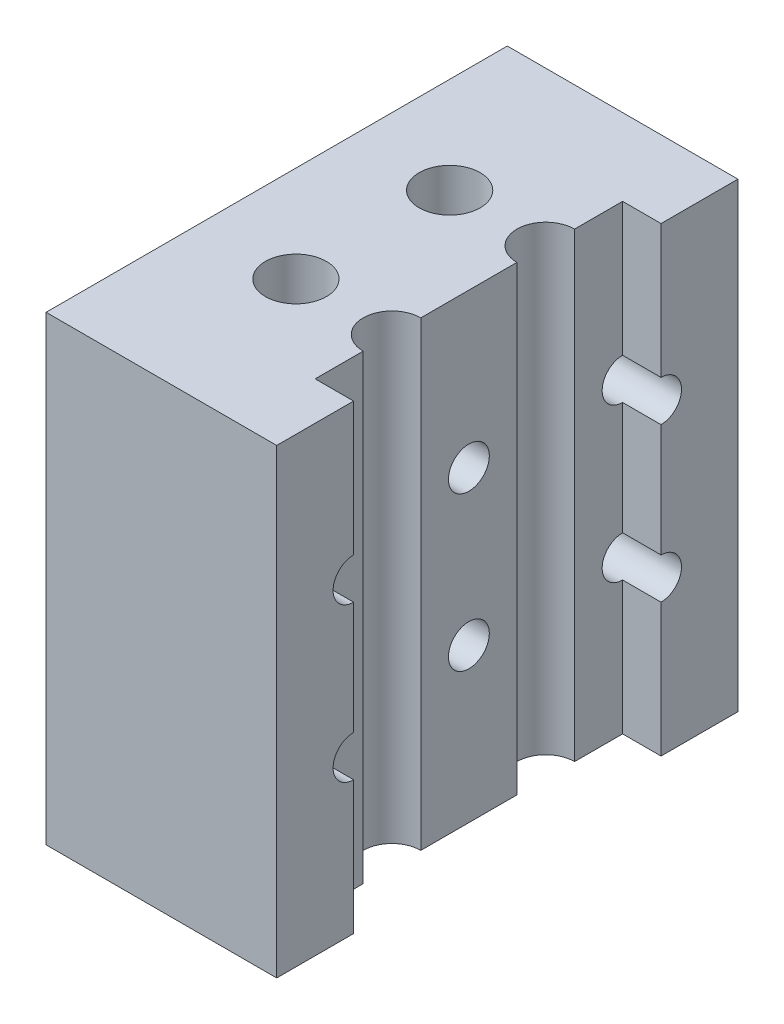
ISO-10303-21;
HEADER;
FILE_DESCRIPTION(('STEP AP214'),'2;1');
FILE_NAME('part.step','',(''),(''),'','','');
FILE_SCHEMA(('AUTOMOTIVE_DESIGN { 1 0 10303 214 1 1 1 1 }'));
ENDSEC;
DATA;
#1=APPLICATION_CONTEXT('core data for automotive mechanical design processes');
#2=APPLICATION_PROTOCOL_DEFINITION('international standard','automotive_design',2000,#1);
#3=PRODUCT_CONTEXT('',#1,'mechanical');
#4=PRODUCT('Part','Part','',(#3));
#5=PRODUCT_RELATED_PRODUCT_CATEGORY('part','',(#4));
#6=PRODUCT_DEFINITION_FORMATION('','',#4);
#7=PRODUCT_DEFINITION_CONTEXT('part definition',#1,'design');
#8=PRODUCT_DEFINITION('design','',#6,#7);
#9=PRODUCT_DEFINITION_SHAPE('','',#8);
#10=(LENGTH_UNIT() NAMED_UNIT(*) SI_UNIT(.MILLI.,.METRE.));
#11=(NAMED_UNIT(*) PLANE_ANGLE_UNIT() SI_UNIT($,.RADIAN.));
#12=(NAMED_UNIT(*) SI_UNIT($,.STERADIAN.) SOLID_ANGLE_UNIT());
#13=UNCERTAINTY_MEASURE_WITH_UNIT(LENGTH_MEASURE(1.E-05),#10,'distance_accuracy_value','');
#14=(GEOMETRIC_REPRESENTATION_CONTEXT(3) GLOBAL_UNCERTAINTY_ASSIGNED_CONTEXT((#13)) GLOBAL_UNIT_ASSIGNED_CONTEXT((#10,
#11,#12)) REPRESENTATION_CONTEXT('',''));
#15=CARTESIAN_POINT('',(0.,0.,0.));
#16=DIRECTION('',(0.,0.,1.));
#17=DIRECTION('',(1.,0.,0.));
#18=AXIS2_PLACEMENT_3D('',#15,#16,#17);
#19=CARTESIAN_POINT('',(-6.34999999999999,0.,-25.4));
#20=DIRECTION('',(-1.,0.,0.));
#21=DIRECTION('',(0.,0.,1.));
#22=AXIS2_PLACEMENT_3D('',#19,#20,#21);
#23=PLANE('',#22);
#24=DIRECTION('',(0.,0.,1.));
#25=VECTOR('',#24,1.);
#26=CARTESIAN_POINT('',(-6.34999999999999,0.,-25.4));
#27=LINE('',#26,#25);
#28=CARTESIAN_POINT('',(-6.34999999999998,0.,17.4625));
#29=VERTEX_POINT('',#28);
#30=CARTESIAN_POINT('',(-6.34999999999998,0.,25.4));
#31=VERTEX_POINT('',#30);
#32=EDGE_CURVE('E188',#29,#31,#27,.T.);
#33=ORIENTED_EDGE('',*,*,#32,.F.);
#34=DIRECTION('',(0.,1.,0.));
#35=VECTOR('',#34,1.);
#36=CARTESIAN_POINT('',(-6.34999999999998,0.,17.4625));
#37=LINE('',#36,#35);
#38=CARTESIAN_POINT('',(-6.34999999999998,76.2,17.4625));
#39=VERTEX_POINT('',#38);
#40=EDGE_CURVE('E50',#29,#39,#37,.T.);
#41=ORIENTED_EDGE('',*,*,#40,.T.);
#42=DIRECTION('',(0.,0.,1.));
#43=VECTOR('',#42,1.);
#44=CARTESIAN_POINT('',(-6.34999999999999,76.2,-25.4));
#45=LINE('',#44,#43);
#46=CARTESIAN_POINT('',(-6.34999999999998,76.2,25.4));
#47=VERTEX_POINT('',#46);
#48=EDGE_CURVE('E201',#39,#47,#45,.T.);
#49=ORIENTED_EDGE('',*,*,#48,.T.);
#50=DIRECTION('',(0.,1.,0.));
#51=VECTOR('',#50,1.);
#52=CARTESIAN_POINT('',(-6.34999999999998,0.,25.4));
#53=LINE('',#52,#51);
#54=CARTESIAN_POINT('',(-6.34999999999998,54.1782,25.4));
#55=VERTEX_POINT('',#54);
#56=EDGE_CURVE('E219',#55,#47,#53,.T.);
#57=ORIENTED_EDGE('',*,*,#56,.F.);
#58=CARTESIAN_POINT('',(-6.34999999999998,50.8,25.4));
#59=DIRECTION('',(-1.,0.,0.));
#60=DIRECTION('',(0.,0.,1.));
#61=AXIS2_PLACEMENT_3D('',#58,#59,#60);
#62=CIRCLE('',#61,3.37819999999999);
#63=CARTESIAN_POINT('',(-6.34999999999998,47.4218,25.4));
#64=VERTEX_POINT('',#63);
#65=EDGE_CURVE('E271',#55,#64,#62,.T.);
#66=ORIENTED_EDGE('',*,*,#65,.T.);
#67=CARTESIAN_POINT('',(-6.34999999999998,28.7782,25.4));
#68=VERTEX_POINT('',#67);
#69=EDGE_CURVE('E218',#68,#64,#53,.T.);
#70=ORIENTED_EDGE('',*,*,#69,.F.);
#71=CARTESIAN_POINT('',(-6.34999999999998,25.4,25.4));
#72=DIRECTION('',(-1.,0.,0.));
#73=DIRECTION('',(0.,0.,1.));
#74=AXIS2_PLACEMENT_3D('',#71,#72,#73);
#75=CIRCLE('',#74,3.37819999999999);
#76=CARTESIAN_POINT('',(-6.34999999999998,22.0218,25.4));
#77=VERTEX_POINT('',#76);
#78=EDGE_CURVE('E274',#68,#77,#75,.T.);
#79=ORIENTED_EDGE('',*,*,#78,.T.);
#80=EDGE_CURVE('E215',#31,#77,#53,.T.);
#81=ORIENTED_EDGE('',*,*,#80,.F.);
#82=EDGE_LOOP('',(#33,#41,#49,#57,#66,#70,#79,#81));
#83=FACE_BOUND('',#82,.T.);
#84=ADVANCED_FACE('F35',(#83),#23,.F.);
#85=CARTESIAN_POINT('',(-6.34999999999999,25.4,0.));
#86=DIRECTION('',(-1.,0.,0.));
#87=DIRECTION('',(0.,0.,1.));
#88=AXIS2_PLACEMENT_3D('',#85,#86,#87);
#89=CIRCLE('',#88,3.37819999999999);
#90=CARTESIAN_POINT('',(-6.34999999999999,25.4,3.37819999999999));
#91=VERTEX_POINT('',#90);
#92=EDGE_CURVE('E278',#91,#91,#89,.T.);
#93=ORIENTED_EDGE('',*,*,#92,.T.);
#94=EDGE_LOOP('',(#93));
#95=FACE_BOUND('',#94,.T.);
#96=CARTESIAN_POINT('',(-6.34999999999999,50.8,0.));
#97=DIRECTION('',(-1.,0.,0.));
#98=DIRECTION('',(0.,0.,1.));
#99=AXIS2_PLACEMENT_3D('',#96,#97,#98);
#100=CIRCLE('',#99,3.37819999999999);
#101=CARTESIAN_POINT('',(-6.34999999999999,50.8,3.37819999999999));
#102=VERTEX_POINT('',#101);
#103=EDGE_CURVE('E283',#102,#102,#100,.T.);
#104=ORIENTED_EDGE('',*,*,#103,.T.);
#105=EDGE_LOOP('',(#104));
#106=FACE_BOUND('',#105,.T.);
#107=CARTESIAN_POINT('',(-6.34999999999999,76.2,-7.9375));
#108=VERTEX_POINT('',#107);
#109=CARTESIAN_POINT('',(-6.34999999999999,76.2,7.9375));
#110=VERTEX_POINT('',#109);
#111=EDGE_CURVE('E182',#108,#110,#45,.T.);
#112=ORIENTED_EDGE('',*,*,#111,.T.);
#113=DIRECTION('',(0.,1.,0.));
#114=VECTOR('',#113,1.);
#115=CARTESIAN_POINT('',(-6.34999999999999,0.,7.9375));
#116=LINE('',#115,#114);
#117=CARTESIAN_POINT('',(-6.34999999999999,0.,7.9375));
#118=VERTEX_POINT('',#117);
#119=EDGE_CURVE('E170',#110,#118,#116,.F.);
#120=ORIENTED_EDGE('',*,*,#119,.T.);
#121=CARTESIAN_POINT('',(-6.34999999999999,0.,-7.9375));
#122=VERTEX_POINT('',#121);
#123=EDGE_CURVE('E180',#122,#118,#27,.T.);
#124=ORIENTED_EDGE('',*,*,#123,.F.);
#125=DIRECTION('',(0.,1.,0.));
#126=VECTOR('',#125,1.);
#127=CARTESIAN_POINT('',(-6.34999999999999,0.,-7.9375));
#128=LINE('',#127,#126);
#129=EDGE_CURVE('E43',#122,#108,#128,.T.);
#130=ORIENTED_EDGE('',*,*,#129,.T.);
#131=EDGE_LOOP('',(#112,#120,#124,#130));
#132=FACE_BOUND('',#131,.T.);
#133=ADVANCED_FACE('F178',(#95,#106,#132),#23,.F.);
#134=CARTESIAN_POINT('',(0.,0.,25.4));
#135=DIRECTION('',(0.,0.,1.));
#136=DIRECTION('',(1.,0.,0.));
#137=AXIS2_PLACEMENT_3D('',#134,#135,#136);
#138=PLANE('',#137);
#139=ORIENTED_EDGE('',*,*,#80,.T.);
#140=DIRECTION('',(1.,0.,0.));
#141=VECTOR('',#140,1.);
#142=CARTESIAN_POINT('',(0.,22.0218,25.4));
#143=LINE('',#142,#141);
#144=CARTESIAN_POINT('',(0.,22.0218,25.4));
#145=VERTEX_POINT('',#144);
#146=EDGE_CURVE('E321',#77,#145,#143,.T.);
#147=ORIENTED_EDGE('',*,*,#146,.T.);
#148=DIRECTION('',(0.,1.,0.));
#149=VECTOR('',#148,1.);
#150=CARTESIAN_POINT('',(0.,0.,25.4));
#151=LINE('',#150,#149);
#152=CARTESIAN_POINT('',(0.,0.,25.4));
#153=VERTEX_POINT('',#152);
#154=EDGE_CURVE('E209',#153,#145,#151,.T.);
#155=ORIENTED_EDGE('',*,*,#154,.F.);
#156=DIRECTION('',(1.,0.,0.));
#157=VECTOR('',#156,1.);
#158=CARTESIAN_POINT('',(0.,0.,25.4));
#159=LINE('',#158,#157);
#160=EDGE_CURVE('E190',#31,#153,#159,.T.);
#161=ORIENTED_EDGE('',*,*,#160,.F.);
#162=EDGE_LOOP('',(#139,#147,#155,#161));
#163=FACE_BOUND('',#162,.T.);
#164=ADVANCED_FACE('F381',(#163),#138,.F.);
#165=CARTESIAN_POINT('',(0.,28.7782,25.4));
#166=VERTEX_POINT('',#165);
#167=CARTESIAN_POINT('',(0.,47.4218,25.4));
#168=VERTEX_POINT('',#167);
#169=EDGE_CURVE('E213',#166,#168,#151,.T.);
#170=ORIENTED_EDGE('',*,*,#169,.F.);
#171=DIRECTION('',(1.,0.,0.));
#172=VECTOR('',#171,1.);
#173=CARTESIAN_POINT('',(0.,28.7782,25.4));
#174=LINE('',#173,#172);
#175=EDGE_CURVE('E384',#166,#68,#174,.F.);
#176=ORIENTED_EDGE('',*,*,#175,.T.);
#177=ORIENTED_EDGE('',*,*,#69,.T.);
#178=DIRECTION('',(1.,0.,0.));
#179=VECTOR('',#178,1.);
#180=CARTESIAN_POINT('',(0.,47.4218,25.4));
#181=LINE('',#180,#179);
#182=EDGE_CURVE('E319',#64,#168,#181,.T.);
#183=ORIENTED_EDGE('',*,*,#182,.T.);
#184=EDGE_LOOP('',(#170,#176,#177,#183));
#185=FACE_BOUND('',#184,.T.);
#186=ADVANCED_FACE('F323',(#185),#138,.F.);
#187=CARTESIAN_POINT('',(0.,0.,-25.4));
#188=DIRECTION('',(0.,0.,-1.));
#189=DIRECTION('',(-1.,0.,0.));
#190=AXIS2_PLACEMENT_3D('',#187,#188,#189);
#191=PLANE('',#190);
#192=DIRECTION('',(0.,1.,0.));
#193=VECTOR('',#192,1.);
#194=CARTESIAN_POINT('',(-6.34999999999999,0.,-25.4));
#195=LINE('',#194,#193);
#196=CARTESIAN_POINT('',(-6.34999999999999,54.1782,-25.4));
#197=VERTEX_POINT('',#196);
#198=CARTESIAN_POINT('',(-6.34999999999999,76.2,-25.4));
#199=VERTEX_POINT('',#198);
#200=EDGE_CURVE('E224',#197,#199,#195,.T.);
#201=ORIENTED_EDGE('',*,*,#200,.F.);
#202=DIRECTION('',(1.,0.,0.));
#203=VECTOR('',#202,1.);
#204=CARTESIAN_POINT('',(0.,54.1782,-25.4));
#205=LINE('',#204,#203);
#206=CARTESIAN_POINT('',(0.,54.1782,-25.4));
#207=VERTEX_POINT('',#206);
#208=EDGE_CURVE('E337',#197,#207,#205,.T.);
#209=ORIENTED_EDGE('',*,*,#208,.T.);
#210=DIRECTION('',(0.,1.,0.));
#211=VECTOR('',#210,1.);
#212=CARTESIAN_POINT('',(0.,0.,-25.4));
#213=LINE('',#212,#211);
#214=CARTESIAN_POINT('',(0.,76.2,-25.4));
#215=VERTEX_POINT('',#214);
#216=EDGE_CURVE('E197',#207,#215,#213,.T.);
#217=ORIENTED_EDGE('',*,*,#216,.T.);
#218=DIRECTION('',(-1.,0.,0.));
#219=VECTOR('',#218,1.);
#220=CARTESIAN_POINT('',(0.,76.2,-25.4));
#221=LINE('',#220,#219);
#222=EDGE_CURVE('E198',#215,#199,#221,.T.);
#223=ORIENTED_EDGE('',*,*,#222,.T.);
#224=EDGE_LOOP('',(#201,#209,#217,#223));
#225=FACE_BOUND('',#224,.T.);
#226=ADVANCED_FACE('F358',(#225),#191,.F.);
#227=CARTESIAN_POINT('',(0.,28.7782,-25.4));
#228=VERTEX_POINT('',#227);
#229=CARTESIAN_POINT('',(0.,47.4218,-25.4));
#230=VERTEX_POINT('',#229);
#231=EDGE_CURVE('E228',#228,#230,#213,.T.);
#232=ORIENTED_EDGE('',*,*,#231,.T.);
#233=DIRECTION('',(1.,0.,0.));
#234=VECTOR('',#233,1.);
#235=CARTESIAN_POINT('',(0.,47.4218,-25.4));
#236=LINE('',#235,#234);
#237=CARTESIAN_POINT('',(-6.34999999999999,47.4218,-25.4));
#238=VERTEX_POINT('',#237);
#239=EDGE_CURVE('E334',#230,#238,#236,.F.);
#240=ORIENTED_EDGE('',*,*,#239,.T.);
#241=CARTESIAN_POINT('',(-6.34999999999999,28.7782,-25.4));
#242=VERTEX_POINT('',#241);
#243=EDGE_CURVE('E223',#242,#238,#195,.T.);
#244=ORIENTED_EDGE('',*,*,#243,.F.);
#245=DIRECTION('',(1.,0.,0.));
#246=VECTOR('',#245,1.);
#247=CARTESIAN_POINT('',(0.,28.7782,-25.4));
#248=LINE('',#247,#246);
#249=EDGE_CURVE('E265',#242,#228,#248,.T.);
#250=ORIENTED_EDGE('',*,*,#249,.T.);
#251=EDGE_LOOP('',(#232,#240,#244,#250));
#252=FACE_BOUND('',#251,.T.);
#253=ADVANCED_FACE('F353',(#252),#191,.F.);
#254=CARTESIAN_POINT('',(0.,76.2,-38.1));
#255=DIRECTION('',(-1.,0.,0.));
#256=DIRECTION('',(0.,0.,1.));
#257=AXIS2_PLACEMENT_3D('',#254,#255,#256);
#258=PLANE('',#257);
#259=ORIENTED_EDGE('',*,*,#154,.T.);
#260=CARTESIAN_POINT('',(0.,25.4,25.4));
#261=DIRECTION('',(1.,0.,0.));
#262=DIRECTION('',(0.,0.,-1.));
#263=AXIS2_PLACEMENT_3D('',#260,#261,#262);
#264=CIRCLE('',#263,3.37819999999999);
#265=EDGE_CURVE('E281',#166,#145,#264,.T.);
#266=ORIENTED_EDGE('',*,*,#265,.F.);
#267=ORIENTED_EDGE('',*,*,#169,.T.);
#268=CARTESIAN_POINT('',(0.,50.8,25.4));
#269=DIRECTION('',(1.,0.,0.));
#270=DIRECTION('',(0.,0.,-1.));
#271=AXIS2_PLACEMENT_3D('',#268,#269,#270);
#272=CIRCLE('',#271,3.37819999999999);
#273=CARTESIAN_POINT('',(0.,54.1782,25.4));
#274=VERTEX_POINT('',#273);
#275=EDGE_CURVE('E310',#274,#168,#272,.T.);
#276=ORIENTED_EDGE('',*,*,#275,.F.);
#277=CARTESIAN_POINT('',(0.,76.2,25.4));
#278=VERTEX_POINT('',#277);
#279=EDGE_CURVE('E214',#274,#278,#151,.T.);
#280=ORIENTED_EDGE('',*,*,#279,.T.);
#281=DIRECTION('',(0.,0.,-1.));
#282=VECTOR('',#281,1.);
#283=CARTESIAN_POINT('',(0.,76.2,-38.1));
#284=LINE('',#283,#282);
#285=CARTESIAN_POINT('',(0.,76.2,38.1));
#286=VERTEX_POINT('',#285);
#287=EDGE_CURVE('E236',#286,#278,#284,.T.);
#288=ORIENTED_EDGE('',*,*,#287,.F.);
#289=DIRECTION('',(0.,-1.,0.));
#290=VECTOR('',#289,1.);
#291=CARTESIAN_POINT('',(0.,76.2,38.1));
#292=LINE('',#291,#290);
#293=CARTESIAN_POINT('',(0.,0.,38.1));
#294=VERTEX_POINT('',#293);
#295=EDGE_CURVE('E256',#286,#294,#292,.T.);
#296=ORIENTED_EDGE('',*,*,#295,.T.);
#297=DIRECTION('',(0.,0.,-1.));
#298=VECTOR('',#297,1.);
#299=CARTESIAN_POINT('',(0.,0.,-38.1));
#300=LINE('',#299,#298);
#301=EDGE_CURVE('E247',#294,#153,#300,.T.);
#302=ORIENTED_EDGE('',*,*,#301,.T.);
#303=EDGE_LOOP('',(#259,#266,#267,#276,#280,#288,#296,#302));
#304=FACE_BOUND('',#303,.T.);
#305=ADVANCED_FACE('F306',(#304),#258,.F.);
#306=CARTESIAN_POINT('',(-38.1,76.2,-38.1));
#307=DIRECTION('',(1.,0.,0.));
#308=DIRECTION('',(0.,0.,-1.));
#309=AXIS2_PLACEMENT_3D('',#306,#307,#308);
#310=PLANE('',#309);
#311=CARTESIAN_POINT('',(-38.1,50.8,0.));
#312=DIRECTION('',(1.,0.,0.));
#313=DIRECTION('',(0.,0.,-1.));
#314=AXIS2_PLACEMENT_3D('',#311,#312,#313);
#315=CIRCLE('',#314,3.37819999999999);
#316=CARTESIAN_POINT('',(-38.1,50.8,-3.37819999999998));
#317=VERTEX_POINT('',#316);
#318=EDGE_CURVE('E286',#317,#317,#315,.T.);
#319=ORIENTED_EDGE('',*,*,#318,.T.);
#320=EDGE_LOOP('',(#319));
#321=FACE_BOUND('',#320,.T.);
#322=CARTESIAN_POINT('',(-38.1,25.4,0.));
#323=DIRECTION('',(1.,0.,0.));
#324=DIRECTION('',(0.,0.,-1.));
#325=AXIS2_PLACEMENT_3D('',#322,#323,#324);
#326=CIRCLE('',#325,3.37819999999999);
#327=CARTESIAN_POINT('',(-38.1,25.4,-3.37819999999998));
#328=VERTEX_POINT('',#327);
#329=EDGE_CURVE('E282',#328,#328,#326,.T.);
#330=ORIENTED_EDGE('',*,*,#329,.T.);
#331=EDGE_LOOP('',(#330));
#332=FACE_BOUND('',#331,.T.);
#333=CARTESIAN_POINT('',(-38.1,25.4,25.4));
#334=DIRECTION('',(1.,0.,0.));
#335=DIRECTION('',(0.,0.,-1.));
#336=AXIS2_PLACEMENT_3D('',#333,#334,#335);
#337=CIRCLE('',#336,3.37819999999999);
#338=CARTESIAN_POINT('',(-38.1,25.4,22.0218));
#339=VERTEX_POINT('',#338);
#340=EDGE_CURVE('E386',#339,#339,#337,.T.);
#341=ORIENTED_EDGE('',*,*,#340,.T.);
#342=EDGE_LOOP('',(#341));
#343=FACE_BOUND('',#342,.T.);
#344=CARTESIAN_POINT('',(-38.1,50.8,25.4));
#345=DIRECTION('',(1.,0.,0.));
#346=DIRECTION('',(0.,0.,-1.));
#347=AXIS2_PLACEMENT_3D('',#344,#345,#346);
#348=CIRCLE('',#347,3.37819999999999);
#349=CARTESIAN_POINT('',(-38.1,50.8,22.0218));
#350=VERTEX_POINT('',#349);
#351=EDGE_CURVE('E320',#350,#350,#348,.T.);
#352=ORIENTED_EDGE('',*,*,#351,.T.);
#353=EDGE_LOOP('',(#352));
#354=FACE_BOUND('',#353,.T.);
#355=CARTESIAN_POINT('',(-38.1,50.8,-25.4));
#356=DIRECTION('',(1.,0.,0.));
#357=DIRECTION('',(0.,0.,-1.));
#358=AXIS2_PLACEMENT_3D('',#355,#356,#357);
#359=CIRCLE('',#358,3.37819999999999);
#360=CARTESIAN_POINT('',(-38.1,50.8,-28.7782));
#361=VERTEX_POINT('',#360);
#362=EDGE_CURVE('E327',#361,#361,#359,.T.);
#363=ORIENTED_EDGE('',*,*,#362,.T.);
#364=EDGE_LOOP('',(#363));
#365=FACE_BOUND('',#364,.T.);
#366=CARTESIAN_POINT('',(-38.1,25.4,-25.4));
#367=DIRECTION('',(1.,0.,0.));
#368=DIRECTION('',(0.,0.,-1.));
#369=AXIS2_PLACEMENT_3D('',#366,#367,#368);
#370=CIRCLE('',#369,3.37819999999999);
#371=CARTESIAN_POINT('',(-38.1,25.4,-28.7782));
#372=VERTEX_POINT('',#371);
#373=EDGE_CURVE('E342',#372,#372,#370,.T.);
#374=ORIENTED_EDGE('',*,*,#373,.T.);
#375=EDGE_LOOP('',(#374));
#376=FACE_BOUND('',#375,.T.);
#377=DIRECTION('',(0.,0.,1.));
#378=VECTOR('',#377,1.);
#379=CARTESIAN_POINT('',(-38.1,0.,-38.1));
#380=LINE('',#379,#378);
#381=CARTESIAN_POINT('',(-38.1,0.,-38.1));
#382=VERTEX_POINT('',#381);
#383=CARTESIAN_POINT('',(-38.1,0.,38.1));
#384=VERTEX_POINT('',#383);
#385=EDGE_CURVE('E212',#382,#384,#380,.T.);
#386=ORIENTED_EDGE('',*,*,#385,.T.);
#387=DIRECTION('',(0.,-1.,0.));
#388=VECTOR('',#387,1.);
#389=CARTESIAN_POINT('',(-38.1,76.2,38.1));
#390=LINE('',#389,#388);
#391=CARTESIAN_POINT('',(-38.1,76.2,38.1));
#392=VERTEX_POINT('',#391);
#393=EDGE_CURVE('E259',#392,#384,#390,.T.);
#394=ORIENTED_EDGE('',*,*,#393,.F.);
#395=DIRECTION('',(0.,0.,1.));
#396=VECTOR('',#395,1.);
#397=CARTESIAN_POINT('',(-38.1,76.2,-38.1));
#398=LINE('',#397,#396);
#399=CARTESIAN_POINT('',(-38.1,76.2,-38.1));
#400=VERTEX_POINT('',#399);
#401=EDGE_CURVE('E229',#400,#392,#398,.T.);
#402=ORIENTED_EDGE('',*,*,#401,.F.);
#403=DIRECTION('',(0.,-1.,0.));
#404=VECTOR('',#403,1.);
#405=CARTESIAN_POINT('',(-38.1,76.2,-38.1));
#406=LINE('',#405,#404);
#407=EDGE_CURVE('E241',#400,#382,#406,.T.);
#408=ORIENTED_EDGE('',*,*,#407,.T.);
#409=EDGE_LOOP('',(#386,#394,#402,#408));
#410=FACE_BOUND('',#409,.T.);
#411=ADVANCED_FACE('F37',(#321,#332,#343,#354,#365,#376,#410),#310,.F.);
#412=CARTESIAN_POINT('',(-38.1,76.2,38.1));
#413=DIRECTION('',(0.,0.,-1.));
#414=DIRECTION('',(-1.,0.,0.));
#415=AXIS2_PLACEMENT_3D('',#412,#413,#414);
#416=PLANE('',#415);
#417=DIRECTION('',(1.,0.,0.));
#418=VECTOR('',#417,1.);
#419=CARTESIAN_POINT('',(-38.1,0.,38.1));
#420=LINE('',#419,#418);
#421=EDGE_CURVE('E244',#384,#294,#420,.T.);
#422=ORIENTED_EDGE('',*,*,#421,.T.);
#423=ORIENTED_EDGE('',*,*,#295,.F.);
#424=DIRECTION('',(1.,0.,0.));
#425=VECTOR('',#424,1.);
#426=CARTESIAN_POINT('',(-38.1,76.2,38.1));
#427=LINE('',#426,#425);
#428=EDGE_CURVE('E232',#392,#286,#427,.T.);
#429=ORIENTED_EDGE('',*,*,#428,.F.);
#430=ORIENTED_EDGE('',*,*,#393,.T.);
#431=EDGE_LOOP('',(#422,#423,#429,#430));
#432=FACE_BOUND('',#431,.T.);
#433=ADVANCED_FACE('F377',(#432),#416,.F.);
#434=ORIENTED_EDGE('',*,*,#216,.F.);
#435=CARTESIAN_POINT('',(0.,50.8,-25.4));
#436=DIRECTION('',(1.,0.,0.));
#437=DIRECTION('',(0.,0.,-1.));
#438=AXIS2_PLACEMENT_3D('',#435,#436,#437);
#439=CIRCLE('',#438,3.37819999999999);
#440=EDGE_CURVE('E325',#230,#207,#439,.T.);
#441=ORIENTED_EDGE('',*,*,#440,.F.);
#442=ORIENTED_EDGE('',*,*,#231,.F.);
#443=CARTESIAN_POINT('',(0.,25.4,-25.4));
#444=DIRECTION('',(1.,0.,0.));
#445=DIRECTION('',(0.,0.,-1.));
#446=AXIS2_PLACEMENT_3D('',#443,#444,#445);
#447=CIRCLE('',#446,3.37819999999999);
#448=CARTESIAN_POINT('',(0.,22.0218,-25.4));
#449=VERTEX_POINT('',#448);
#450=EDGE_CURVE('E340',#449,#228,#447,.T.);
#451=ORIENTED_EDGE('',*,*,#450,.F.);
#452=CARTESIAN_POINT('',(0.,0.,-25.4));
#453=VERTEX_POINT('',#452);
#454=EDGE_CURVE('E225',#453,#449,#213,.T.);
#455=ORIENTED_EDGE('',*,*,#454,.F.);
#456=CARTESIAN_POINT('',(0.,0.,-38.1));
#457=VERTEX_POINT('',#456);
#458=EDGE_CURVE('E246',#453,#457,#300,.T.);
#459=ORIENTED_EDGE('',*,*,#458,.T.);
#460=DIRECTION('',(0.,-1.,0.));
#461=VECTOR('',#460,1.);
#462=CARTESIAN_POINT('',(0.,76.2,-38.1));
#463=LINE('',#462,#461);
#464=CARTESIAN_POINT('',(0.,76.2,-38.1));
#465=VERTEX_POINT('',#464);
#466=EDGE_CURVE('E253',#465,#457,#463,.T.);
#467=ORIENTED_EDGE('',*,*,#466,.F.);
#468=EDGE_CURVE('E235',#215,#465,#284,.T.);
#469=ORIENTED_EDGE('',*,*,#468,.F.);
#470=EDGE_LOOP('',(#434,#441,#442,#451,#455,#459,#467,#469));
#471=FACE_BOUND('',#470,.T.);
#472=ADVANCED_FACE('F363',(#471),#258,.F.);
#473=CARTESIAN_POINT('',(-38.1,76.2,-38.1));
#474=DIRECTION('',(0.,0.,1.));
#475=DIRECTION('',(1.,0.,0.));
#476=AXIS2_PLACEMENT_3D('',#473,#474,#475);
#477=PLANE('',#476);
#478=DIRECTION('',(-1.,0.,0.));
#479=VECTOR('',#478,1.);
#480=CARTESIAN_POINT('',(-38.1,0.,-38.1));
#481=LINE('',#480,#479);
#482=EDGE_CURVE('E233',#457,#382,#481,.T.);
#483=ORIENTED_EDGE('',*,*,#482,.T.);
#484=ORIENTED_EDGE('',*,*,#407,.F.);
#485=DIRECTION('',(-1.,0.,0.));
#486=VECTOR('',#485,1.);
#487=CARTESIAN_POINT('',(-38.1,76.2,-38.1));
#488=LINE('',#487,#486);
#489=EDGE_CURVE('E239',#465,#400,#488,.T.);
#490=ORIENTED_EDGE('',*,*,#489,.F.);
#491=ORIENTED_EDGE('',*,*,#466,.T.);
#492=EDGE_LOOP('',(#483,#484,#490,#491));
#493=FACE_BOUND('',#492,.T.);
#494=ADVANCED_FACE('F371',(#493),#477,.F.);
#495=CARTESIAN_POINT('',(0.,76.2,0.));
#496=DIRECTION('',(0.,1.,0.));
#497=DIRECTION('',(0.,0.,1.));
#498=AXIS2_PLACEMENT_3D('',#495,#496,#497);
#499=PLANE('',#498);
#500=CARTESIAN_POINT('',(-6.34999999999999,76.2,12.7));
#501=DIRECTION('',(0.,1.,0.));
#502=DIRECTION('',(0.,0.,1.));
#503=AXIS2_PLACEMENT_3D('',#500,#501,#502);
#504=CIRCLE('',#503,4.7625);
#505=EDGE_CURVE('E183',#110,#39,#504,.T.);
#506=ORIENTED_EDGE('',*,*,#505,.F.);
#507=ORIENTED_EDGE('',*,*,#111,.F.);
#508=CARTESIAN_POINT('',(-6.34999999999999,76.2,-12.7));
#509=DIRECTION('',(0.,1.,0.));
#510=DIRECTION('',(0.,0.,1.));
#511=AXIS2_PLACEMENT_3D('',#508,#509,#510);
#512=CIRCLE('',#511,4.7625);
#513=CARTESIAN_POINT('',(-6.34999999999999,76.2,-17.4625));
#514=VERTEX_POINT('',#513);
#515=EDGE_CURVE('E292',#514,#108,#512,.T.);
#516=ORIENTED_EDGE('',*,*,#515,.F.);
#517=EDGE_CURVE('E203',#199,#514,#45,.T.);
#518=ORIENTED_EDGE('',*,*,#517,.F.);
#519=ORIENTED_EDGE('',*,*,#222,.F.);
#520=ORIENTED_EDGE('',*,*,#468,.T.);
#521=ORIENTED_EDGE('',*,*,#489,.T.);
#522=ORIENTED_EDGE('',*,*,#401,.T.);
#523=ORIENTED_EDGE('',*,*,#428,.T.);
#524=ORIENTED_EDGE('',*,*,#287,.T.);
#525=DIRECTION('',(1.,0.,0.));
#526=VECTOR('',#525,1.);
#527=CARTESIAN_POINT('',(0.,76.2,25.4));
#528=LINE('',#527,#526);
#529=EDGE_CURVE('E206',#47,#278,#528,.T.);
#530=ORIENTED_EDGE('',*,*,#529,.F.);
#531=ORIENTED_EDGE('',*,*,#48,.F.);
#532=EDGE_LOOP('',(#506,#507,#516,#518,#519,#520,#521,#522,#523,#524,#530,#531));
#533=FACE_BOUND('',#532,.T.);
#534=CARTESIAN_POINT('',(-22.225,76.2,12.7));
#535=DIRECTION('',(0.,1.,0.));
#536=DIRECTION('',(0.,0.,1.));
#537=AXIS2_PLACEMENT_3D('',#534,#535,#536);
#538=CIRCLE('',#537,5.04189999999999);
#539=CARTESIAN_POINT('',(-22.225,76.2,17.7419));
#540=VERTEX_POINT('',#539);
#541=EDGE_CURVE('E472',#540,#540,#538,.T.);
#542=ORIENTED_EDGE('',*,*,#541,.F.);
#543=EDGE_LOOP('',(#542));
#544=FACE_BOUND('',#543,.T.);
#545=CARTESIAN_POINT('',(-22.225,76.2,-12.7));
#546=DIRECTION('',(0.,1.,0.));
#547=DIRECTION('',(0.,0.,1.));
#548=AXIS2_PLACEMENT_3D('',#545,#546,#547);
#549=CIRCLE('',#548,5.04189999999999);
#550=CARTESIAN_POINT('',(-22.225,76.2,-7.65810000000001));
#551=VERTEX_POINT('',#550);
#552=EDGE_CURVE('E466',#551,#551,#549,.T.);
#553=ORIENTED_EDGE('',*,*,#552,.F.);
#554=EDGE_LOOP('',(#553));
#555=FACE_BOUND('',#554,.T.);
#556=ADVANCED_FACE('F289',(#533,#544,#555),#499,.T.);
#557=CARTESIAN_POINT('',(0.,0.,0.));
#558=DIRECTION('',(0.,1.,0.));
#559=DIRECTION('',(0.,0.,1.));
#560=AXIS2_PLACEMENT_3D('',#557,#558,#559);
#561=PLANE('',#560);
#562=CARTESIAN_POINT('',(-22.225,0.,12.7));
#563=DIRECTION('',(0.,1.,0.));
#564=DIRECTION('',(0.,0.,1.));
#565=AXIS2_PLACEMENT_3D('',#562,#563,#564);
#566=CIRCLE('',#565,5.04189999999998);
#567=CARTESIAN_POINT('',(-22.225,0.,17.7419));
#568=VERTEX_POINT('',#567);
#569=EDGE_CURVE('E469',#568,#568,#566,.T.);
#570=ORIENTED_EDGE('',*,*,#569,.T.);
#571=EDGE_LOOP('',(#570));
#572=FACE_BOUND('',#571,.T.);
#573=CARTESIAN_POINT('',(-22.225,0.,-12.7));
#574=DIRECTION('',(0.,1.,0.));
#575=DIRECTION('',(0.,0.,1.));
#576=AXIS2_PLACEMENT_3D('',#573,#574,#575);
#577=CIRCLE('',#576,5.04189999999998);
#578=CARTESIAN_POINT('',(-22.225,0.,-7.65810000000002));
#579=VERTEX_POINT('',#578);
#580=EDGE_CURVE('E463',#579,#579,#577,.T.);
#581=ORIENTED_EDGE('',*,*,#580,.T.);
#582=EDGE_LOOP('',(#581));
#583=FACE_BOUND('',#582,.T.);
#584=ORIENTED_EDGE('',*,*,#123,.T.);
#585=CARTESIAN_POINT('',(-6.34999999999999,0.,12.7));
#586=DIRECTION('',(0.,1.,0.));
#587=DIRECTION('',(0.,0.,1.));
#588=AXIS2_PLACEMENT_3D('',#585,#586,#587);
#589=CIRCLE('',#588,4.7625);
#590=EDGE_CURVE('E11',#118,#29,#589,.T.);
#591=ORIENTED_EDGE('',*,*,#590,.T.);
#592=ORIENTED_EDGE('',*,*,#32,.T.);
#593=ORIENTED_EDGE('',*,*,#160,.T.);
#594=ORIENTED_EDGE('',*,*,#301,.F.);
#595=ORIENTED_EDGE('',*,*,#421,.F.);
#596=ORIENTED_EDGE('',*,*,#385,.F.);
#597=ORIENTED_EDGE('',*,*,#482,.F.);
#598=ORIENTED_EDGE('',*,*,#458,.F.);
#599=DIRECTION('',(-1.,0.,0.));
#600=VECTOR('',#599,1.);
#601=CARTESIAN_POINT('',(0.,0.,-25.4));
#602=LINE('',#601,#600);
#603=CARTESIAN_POINT('',(-6.34999999999999,0.,-25.4));
#604=VERTEX_POINT('',#603);
#605=EDGE_CURVE('E191',#453,#604,#602,.T.);
#606=ORIENTED_EDGE('',*,*,#605,.T.);
#607=CARTESIAN_POINT('',(-6.34999999999999,0.,-17.4625));
#608=VERTEX_POINT('',#607);
#609=EDGE_CURVE('E187',#604,#608,#27,.T.);
#610=ORIENTED_EDGE('',*,*,#609,.T.);
#611=CARTESIAN_POINT('',(-6.34999999999999,0.,-12.7));
#612=DIRECTION('',(0.,1.,0.));
#613=DIRECTION('',(0.,0.,1.));
#614=AXIS2_PLACEMENT_3D('',#611,#612,#613);
#615=CIRCLE('',#614,4.7625);
#616=EDGE_CURVE('E57',#608,#122,#615,.T.);
#617=ORIENTED_EDGE('',*,*,#616,.T.);
#618=EDGE_LOOP('',(#584,#591,#592,#593,#594,#595,#596,#597,#598,#606,#610,#617));
#619=FACE_BOUND('',#618,.T.);
#620=ADVANCED_FACE('F185',(#572,#583,#619),#561,.F.);
#621=ORIENTED_EDGE('',*,*,#279,.F.);
#622=DIRECTION('',(1.,0.,0.));
#623=VECTOR('',#622,1.);
#624=CARTESIAN_POINT('',(0.,54.1782,25.4));
#625=LINE('',#624,#623);
#626=EDGE_CURVE('E302',#274,#55,#625,.F.);
#627=ORIENTED_EDGE('',*,*,#626,.T.);
#628=ORIENTED_EDGE('',*,*,#56,.T.);
#629=ORIENTED_EDGE('',*,*,#529,.T.);
#630=EDGE_LOOP('',(#621,#627,#628,#629));
#631=FACE_BOUND('',#630,.T.);
#632=ADVANCED_FACE('F301',(#631),#138,.F.);
#633=ORIENTED_EDGE('',*,*,#517,.T.);
#634=DIRECTION('',(0.,1.,0.));
#635=VECTOR('',#634,1.);
#636=CARTESIAN_POINT('',(-6.34999999999999,0.,-17.4625));
#637=LINE('',#636,#635);
#638=EDGE_CURVE('E277',#514,#608,#637,.F.);
#639=ORIENTED_EDGE('',*,*,#638,.T.);
#640=ORIENTED_EDGE('',*,*,#609,.F.);
#641=CARTESIAN_POINT('',(-6.34999999999999,22.0218,-25.4));
#642=VERTEX_POINT('',#641);
#643=EDGE_CURVE('E220',#604,#642,#195,.T.);
#644=ORIENTED_EDGE('',*,*,#643,.T.);
#645=CARTESIAN_POINT('',(-6.34999999999999,25.4,-25.4));
#646=DIRECTION('',(-1.,0.,0.));
#647=DIRECTION('',(0.,0.,1.));
#648=AXIS2_PLACEMENT_3D('',#645,#646,#647);
#649=CIRCLE('',#648,3.37819999999999);
#650=EDGE_CURVE('E202',#642,#242,#649,.T.);
#651=ORIENTED_EDGE('',*,*,#650,.T.);
#652=ORIENTED_EDGE('',*,*,#243,.T.);
#653=CARTESIAN_POINT('',(-6.34999999999999,50.8,-25.4));
#654=DIRECTION('',(-1.,0.,0.));
#655=DIRECTION('',(0.,0.,1.));
#656=AXIS2_PLACEMENT_3D('',#653,#654,#655);
#657=CIRCLE('',#656,3.37819999999999);
#658=EDGE_CURVE('E268',#238,#197,#657,.T.);
#659=ORIENTED_EDGE('',*,*,#658,.T.);
#660=ORIENTED_EDGE('',*,*,#200,.T.);
#661=EDGE_LOOP('',(#633,#639,#640,#644,#651,#652,#659,#660));
#662=FACE_BOUND('',#661,.T.);
#663=ADVANCED_FACE('F348',(#662),#23,.F.);
#664=ORIENTED_EDGE('',*,*,#454,.T.);
#665=DIRECTION('',(1.,0.,0.));
#666=VECTOR('',#665,1.);
#667=CARTESIAN_POINT('',(0.,22.0218,-25.4));
#668=LINE('',#667,#666);
#669=EDGE_CURVE('E262',#449,#642,#668,.F.);
#670=ORIENTED_EDGE('',*,*,#669,.T.);
#671=ORIENTED_EDGE('',*,*,#643,.F.);
#672=ORIENTED_EDGE('',*,*,#605,.F.);
#673=EDGE_LOOP('',(#664,#670,#671,#672));
#674=FACE_BOUND('',#673,.T.);
#675=ADVANCED_FACE('F417',(#674),#191,.F.);
#676=CARTESIAN_POINT('',(0.,25.4,-25.4));
#677=DIRECTION('',(1.,0.,0.));
#678=DIRECTION('',(0.,0.,-1.));
#679=AXIS2_PLACEMENT_3D('',#676,#677,#678);
#680=CYLINDRICAL_SURFACE('',#679,3.37819999999999);
#681=ORIENTED_EDGE('',*,*,#373,.F.);
#682=EDGE_LOOP('',(#681));
#683=FACE_BOUND('',#682,.T.);
#684=ORIENTED_EDGE('',*,*,#650,.F.);
#685=ORIENTED_EDGE('',*,*,#669,.F.);
#686=ORIENTED_EDGE('',*,*,#450,.T.);
#687=ORIENTED_EDGE('',*,*,#249,.F.);
#688=EDGE_LOOP('',(#684,#685,#686,#687));
#689=FACE_BOUND('',#688,.T.);
#690=ADVANCED_FACE('F405',(#683,#689),#680,.F.);
#691=CARTESIAN_POINT('',(0.,50.8,-25.4));
#692=DIRECTION('',(1.,0.,0.));
#693=DIRECTION('',(0.,0.,-1.));
#694=AXIS2_PLACEMENT_3D('',#691,#692,#693);
#695=CYLINDRICAL_SURFACE('',#694,3.37819999999999);
#696=ORIENTED_EDGE('',*,*,#362,.F.);
#697=EDGE_LOOP('',(#696));
#698=FACE_BOUND('',#697,.T.);
#699=ORIENTED_EDGE('',*,*,#658,.F.);
#700=ORIENTED_EDGE('',*,*,#239,.F.);
#701=ORIENTED_EDGE('',*,*,#440,.T.);
#702=ORIENTED_EDGE('',*,*,#208,.F.);
#703=EDGE_LOOP('',(#699,#700,#701,#702));
#704=FACE_BOUND('',#703,.T.);
#705=ADVANCED_FACE('F396',(#698,#704),#695,.F.);
#706=CARTESIAN_POINT('',(0.,50.8,25.4));
#707=DIRECTION('',(1.,0.,0.));
#708=DIRECTION('',(0.,0.,-1.));
#709=AXIS2_PLACEMENT_3D('',#706,#707,#708);
#710=CYLINDRICAL_SURFACE('',#709,3.37819999999999);
#711=ORIENTED_EDGE('',*,*,#351,.F.);
#712=EDGE_LOOP('',(#711));
#713=FACE_BOUND('',#712,.T.);
#714=ORIENTED_EDGE('',*,*,#65,.F.);
#715=ORIENTED_EDGE('',*,*,#626,.F.);
#716=ORIENTED_EDGE('',*,*,#275,.T.);
#717=ORIENTED_EDGE('',*,*,#182,.F.);
#718=EDGE_LOOP('',(#714,#715,#716,#717));
#719=FACE_BOUND('',#718,.T.);
#720=ADVANCED_FACE('F318',(#713,#719),#710,.F.);
#721=CARTESIAN_POINT('',(0.,25.4,25.4));
#722=DIRECTION('',(1.,0.,0.));
#723=DIRECTION('',(0.,0.,-1.));
#724=AXIS2_PLACEMENT_3D('',#721,#722,#723);
#725=CYLINDRICAL_SURFACE('',#724,3.37819999999999);
#726=ORIENTED_EDGE('',*,*,#340,.F.);
#727=EDGE_LOOP('',(#726));
#728=FACE_BOUND('',#727,.T.);
#729=ORIENTED_EDGE('',*,*,#78,.F.);
#730=ORIENTED_EDGE('',*,*,#175,.F.);
#731=ORIENTED_EDGE('',*,*,#265,.T.);
#732=ORIENTED_EDGE('',*,*,#146,.F.);
#733=EDGE_LOOP('',(#729,#730,#731,#732));
#734=FACE_BOUND('',#733,.T.);
#735=ADVANCED_FACE('F395',(#728,#734),#725,.F.);
#736=CARTESIAN_POINT('',(0.,25.4,0.));
#737=DIRECTION('',(1.,0.,0.));
#738=DIRECTION('',(0.,0.,-1.));
#739=AXIS2_PLACEMENT_3D('',#736,#737,#738);
#740=CYLINDRICAL_SURFACE('',#739,3.37819999999999);
#741=ORIENTED_EDGE('',*,*,#329,.F.);
#742=EDGE_LOOP('',(#741));
#743=FACE_BOUND('',#742,.T.);
#744=ORIENTED_EDGE('',*,*,#92,.F.);
#745=EDGE_LOOP('',(#744));
#746=FACE_BOUND('',#745,.T.);
#747=ADVANCED_FACE('F402',(#743,#746),#740,.F.);
#748=CARTESIAN_POINT('',(0.,50.8,0.));
#749=DIRECTION('',(1.,0.,0.));
#750=DIRECTION('',(0.,0.,-1.));
#751=AXIS2_PLACEMENT_3D('',#748,#749,#750);
#752=CYLINDRICAL_SURFACE('',#751,3.37819999999999);
#753=ORIENTED_EDGE('',*,*,#318,.F.);
#754=EDGE_LOOP('',(#753));
#755=FACE_BOUND('',#754,.T.);
#756=ORIENTED_EDGE('',*,*,#103,.F.);
#757=EDGE_LOOP('',(#756));
#758=FACE_BOUND('',#757,.T.);
#759=ADVANCED_FACE('F512',(#755,#758),#752,.F.);
#760=CARTESIAN_POINT('',(-22.225,76.2,-12.7));
#761=DIRECTION('',(0.,1.,0.));
#762=DIRECTION('',(0.,0.,1.));
#763=AXIS2_PLACEMENT_3D('',#760,#761,#762);
#764=CYLINDRICAL_SURFACE('',#763,5.04189999999999);
#765=ORIENTED_EDGE('',*,*,#580,.F.);
#766=EDGE_LOOP('',(#765));
#767=FACE_BOUND('',#766,.T.);
#768=ORIENTED_EDGE('',*,*,#552,.T.);
#769=EDGE_LOOP('',(#768));
#770=FACE_BOUND('',#769,.T.);
#771=ADVANCED_FACE('F522',(#767,#770),#764,.F.);
#772=CARTESIAN_POINT('',(-22.225,76.2,12.7));
#773=DIRECTION('',(0.,1.,0.));
#774=DIRECTION('',(0.,0.,1.));
#775=AXIS2_PLACEMENT_3D('',#772,#773,#774);
#776=CYLINDRICAL_SURFACE('',#775,5.04189999999999);
#777=ORIENTED_EDGE('',*,*,#569,.F.);
#778=EDGE_LOOP('',(#777));
#779=FACE_BOUND('',#778,.T.);
#780=ORIENTED_EDGE('',*,*,#541,.T.);
#781=EDGE_LOOP('',(#780));
#782=FACE_BOUND('',#781,.T.);
#783=ADVANCED_FACE('F532',(#779,#782),#776,.F.);
#784=CARTESIAN_POINT('',(-6.34999999999999,0.,-12.7));
#785=DIRECTION('',(0.,1.,0.));
#786=DIRECTION('',(0.,0.,1.));
#787=AXIS2_PLACEMENT_3D('',#784,#785,#786);
#788=CYLINDRICAL_SURFACE('',#787,4.7625);
#789=ORIENTED_EDGE('',*,*,#616,.F.);
#790=ORIENTED_EDGE('',*,*,#638,.F.);
#791=ORIENTED_EDGE('',*,*,#515,.T.);
#792=ORIENTED_EDGE('',*,*,#129,.F.);
#793=EDGE_LOOP('',(#789,#790,#791,#792));
#794=FACE_BOUND('',#793,.T.);
#795=ADVANCED_FACE('F478',(#794),#788,.F.);
#796=CARTESIAN_POINT('',(-6.34999999999999,0.,12.7));
#797=DIRECTION('',(0.,1.,0.));
#798=DIRECTION('',(0.,0.,1.));
#799=AXIS2_PLACEMENT_3D('',#796,#797,#798);
#800=CYLINDRICAL_SURFACE('',#799,4.7625);
#801=ORIENTED_EDGE('',*,*,#590,.F.);
#802=ORIENTED_EDGE('',*,*,#119,.F.);
#803=ORIENTED_EDGE('',*,*,#505,.T.);
#804=ORIENTED_EDGE('',*,*,#40,.F.);
#805=EDGE_LOOP('',(#801,#802,#803,#804));
#806=FACE_BOUND('',#805,.T.);
#807=ADVANCED_FACE('F169',(#806),#800,.F.);
#808=CLOSED_SHELL('',(#84,#133,#164,#186,#226,#253,#305,#411,#433,#472,#494,#556,#620,#632,#663,
#675,#690,#705,#720,#735,#747,#759,#771,#783,#795,#807));
#809=MANIFOLD_SOLID_BREP('B2',#808);
#810=ADVANCED_BREP_SHAPE_REPRESENTATION('',(#18,#809),#14);
#811=SHAPE_DEFINITION_REPRESENTATION(#9,#810);
ENDSEC;
END-ISO-10303-21;
